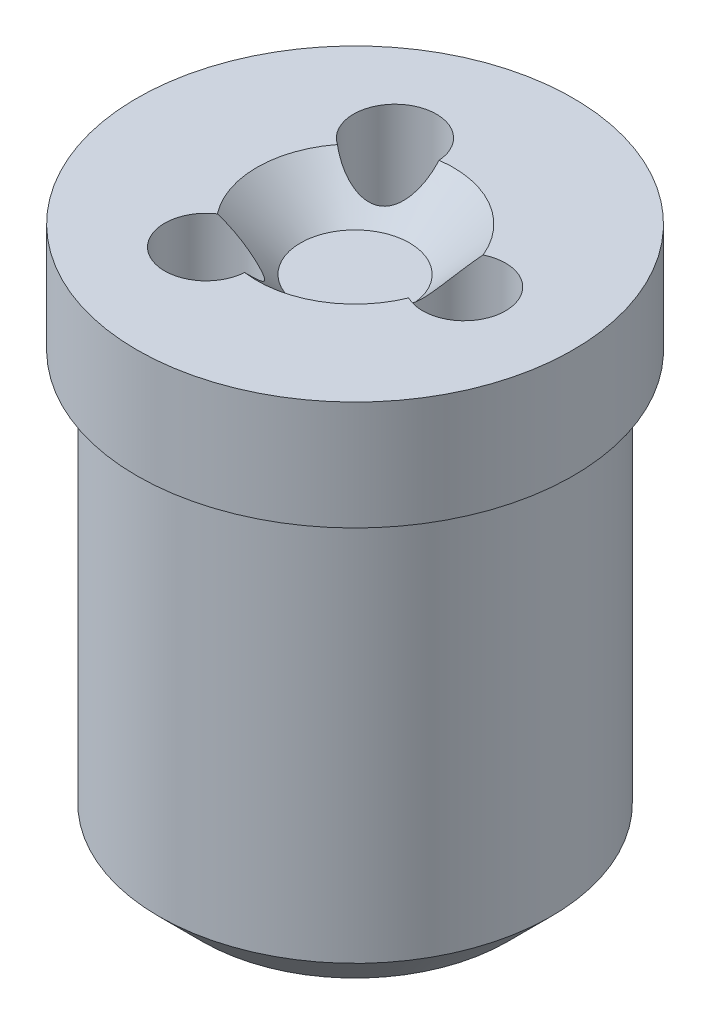
ISO-10303-21;
HEADER;
FILE_DESCRIPTION(('STEP AP214'),'2;1');
FILE_NAME('part.step','',(''),(''),'','','');
FILE_SCHEMA(('AUTOMOTIVE_DESIGN { 1 0 10303 214 1 1 1 1 }'));
ENDSEC;
DATA;
#1=APPLICATION_CONTEXT('core data for automotive mechanical design processes');
#2=APPLICATION_PROTOCOL_DEFINITION('international standard','automotive_design',2000,#1);
#3=PRODUCT_CONTEXT('',#1,'mechanical');
#4=PRODUCT('Part','Part','',(#3));
#5=PRODUCT_RELATED_PRODUCT_CATEGORY('part','',(#4));
#6=PRODUCT_DEFINITION_FORMATION('','',#4);
#7=PRODUCT_DEFINITION_CONTEXT('part definition',#1,'design');
#8=PRODUCT_DEFINITION('design','',#6,#7);
#9=PRODUCT_DEFINITION_SHAPE('','',#8);
#10=(LENGTH_UNIT() NAMED_UNIT(*) SI_UNIT(.MILLI.,.METRE.));
#11=(NAMED_UNIT(*) PLANE_ANGLE_UNIT() SI_UNIT($,.RADIAN.));
#12=(NAMED_UNIT(*) SI_UNIT($,.STERADIAN.) SOLID_ANGLE_UNIT());
#13=UNCERTAINTY_MEASURE_WITH_UNIT(LENGTH_MEASURE(1.E-05),#10,'distance_accuracy_value','');
#14=(GEOMETRIC_REPRESENTATION_CONTEXT(3) GLOBAL_UNCERTAINTY_ASSIGNED_CONTEXT((#13)) GLOBAL_UNIT_ASSIGNED_CONTEXT((#10,
#11,#12)) REPRESENTATION_CONTEXT('',''));
#15=CARTESIAN_POINT('',(0.,0.,0.));
#16=DIRECTION('',(0.,0.,1.));
#17=DIRECTION('',(1.,0.,0.));
#18=AXIS2_PLACEMENT_3D('',#15,#16,#17);
#19=CARTESIAN_POINT('',(-2.5,-11.,-4.33012701892219));
#20=DIRECTION('',(0.,1.,0.));
#21=DIRECTION('',(0.,0.,1.));
#22=AXIS2_PLACEMENT_3D('',#19,#20,#21);
#23=CYLINDRICAL_SURFACE('',#22,1.9);
#24=CARTESIAN_POINT('',(-2.5,0.,-4.33012701892219));
#25=DIRECTION('',(0.,1.,0.));
#26=DIRECTION('',(0.,0.,1.));
#27=AXIS2_PLACEMENT_3D('',#24,#25,#26);
#28=CIRCLE('',#27,1.9);
#29=CARTESIAN_POINT('',(-2.5,0.,-2.43012701892219));
#30=VERTEX_POINT('',#29);
#31=EDGE_CURVE('E89',#30,#30,#28,.T.);
#32=ORIENTED_EDGE('',*,*,#31,.F.);
#33=EDGE_LOOP('',(#32));
#34=FACE_BOUND('',#33,.T.);
#35=CARTESIAN_POINT('',(-0.604404751104225,25.0002000000001,-4.45942764677746));
#36=CARTESIAN_POINT('',(-0.599668557166781,24.9303759153267,-4.38957427828879));
#37=CARTESIAN_POINT('',(-0.598730209900113,24.8606328105864,-4.31934334640202));
#38=CARTESIAN_POINT('',(-0.604752949242094,24.7217550651831,-4.17824515643162));
#39=CARTESIAN_POINT('',(-0.611735709990161,24.6526226181537,-4.10737668136013));
#40=CARTESIAN_POINT('',(-0.634065851653406,24.5149881738562,-3.9646642158343));
#41=CARTESIAN_POINT('',(-0.649511840514175,24.4465034848329,-3.89281865744846));
#42=CARTESIAN_POINT('',(-0.689402532026935,24.3120902945434,-3.74937250094704));
#43=CARTESIAN_POINT('',(-0.713835124648289,24.2461584846532,-3.67777170345184));
#44=CARTESIAN_POINT('',(-0.771108008455887,24.1215479889046,-3.53874041544459));
#45=CARTESIAN_POINT('',(-0.803449280419485,24.062670583967,-3.47128541643546));
#46=CARTESIAN_POINT('',(-0.878183755784847,23.9505735107202,-3.33736371671739));
#47=CARTESIAN_POINT('',(-0.920554614180125,23.8973416410528,-3.27089516320321));
#48=CARTESIAN_POINT('',(-1.00808025592113,23.8086058119301,-3.15174014058094));
#49=CARTESIAN_POINT('',(-1.05131422864947,23.7716396058287,-3.0987531381169));
#50=CARTESIAN_POINT('',(-1.14628022286434,23.7063390077541,-2.99507863368145));
#51=CARTESIAN_POINT('',(-1.19799459130712,23.6779870266942,-2.94438662832827));
#52=CARTESIAN_POINT('',(-1.29654676217973,23.6385868521668,-2.8587726616446));
#53=CARTESIAN_POINT('',(-1.34160213331784,23.6250236935653,-2.82297466261922));
#54=CARTESIAN_POINT('',(-1.4359483091511,23.6061957555486,-2.75495590309173));
#55=CARTESIAN_POINT('',(-1.48523482303968,23.6009226715887,-2.72273159278756));
#56=CARTESIAN_POINT('',(-1.58682841535246,23.5992992592671,-2.66291409368128));
#57=CARTESIAN_POINT('',(-1.63914166703556,23.6029678427725,-2.63533085272249));
#58=CARTESIAN_POINT('',(-1.74503504432828,23.6188093273341,-2.58557511922954));
#59=CARTESIAN_POINT('',(-1.79861622022461,23.6309895355343,-2.56340729786311));
#60=CARTESIAN_POINT('',(-1.92040610745496,23.6669539738895,-2.51922961085677));
#61=CARTESIAN_POINT('',(-1.98856199076442,23.6930158167412,-2.49895897777599));
#62=CARTESIAN_POINT('',(-2.12291130313104,23.7537916159803,-2.46663399252473));
#63=CARTESIAN_POINT('',(-2.18910016358683,23.7885241836469,-2.45459752518222));
#64=CARTESIAN_POINT('',(-2.35671778677612,23.8859893916301,-2.43270144820569));
#65=CARTESIAN_POINT('',(-2.45618411238218,23.9532377459125,-2.42820604233024));
#66=CARTESIAN_POINT('',(-2.64870118932149,24.0963011275469,-2.43349572689294));
#67=CARTESIAN_POINT('',(-2.74171670447375,24.1721580211519,-2.44335362909352));
#68=CARTESIAN_POINT('',(-2.90000665951015,24.3100765658009,-2.47141371366074));
#69=CARTESIAN_POINT('',(-2.96662847608191,24.3711432659243,-2.48708246915917));
#70=CARTESIAN_POINT('',(-3.09629345186112,24.4951495447694,-2.52485730322536));
#71=CARTESIAN_POINT('',(-3.15933378504841,24.558090544352,-2.54696838315807));
#72=CARTESIAN_POINT('',(-3.28071058970273,24.6839749831661,-2.59671438997999));
#73=CARTESIAN_POINT('',(-3.33911026436135,24.7468989340282,-2.6242453935206));
#74=CARTESIAN_POINT('',(-3.4522098436499,24.8732567455034,-2.68471451405383));
#75=CARTESIAN_POINT('',(-3.50691586334787,24.9366895586115,-2.71764336844748));
#76=CARTESIAN_POINT('',(-3.55977525289579,25.0002,-2.75314369201297));
#77=B_SPLINE_CURVE_WITH_KNOTS('',3,(#35,#36,#37,#38,#39,#40,#41,#42,#43,#44,#45,#46,#47,#48,#49,
#50,#51,#52,#53,#54,#55,#56,#57,#58,#59,#60,#61,#62,#63,#64,#65,#66,#67,#68,#69,#70,#71,#72,#73,
#74,#75,#76),.UNSPECIFIED.,.F.,.F.,(4,2,2,2,2,2,2,2,2,2,2,2,2,2,2,2,2,2,2,2,4),(0.,
0.296608560011013,0.594030677231719,0.894994214319666,1.19555366061906,1.48060069933349,
1.7650185591453,1.99750632028336,2.22951613214999,2.40614634553788,2.58259950740994,
2.75942619618997,2.93640487569256,3.16232924754416,3.38874278828777,3.74721173724148,
4.10750548252977,4.38235082863932,4.65741011635818,4.92763471089975,5.19740036863589),.UNSPECIFIED.);
#78=CARTESIAN_POINT('',(-0.604391120763007,25.,-4.45922766554286));
#79=VERTEX_POINT('',#78);
#80=CARTESIAN_POINT('',(-3.5596088792363,24.9999999999992,-2.75303189717348));
#81=VERTEX_POINT('',#80);
#82=EDGE_CURVE('E61',#79,#81,#77,.T.);
#83=ORIENTED_EDGE('',*,*,#82,.F.);
#84=CARTESIAN_POINT('',(-2.5,25.,-4.33012701892219));
#85=DIRECTION('',(0.,1.,0.));
#86=DIRECTION('',(0.,0.,1.));
#87=AXIS2_PLACEMENT_3D('',#84,#85,#86);
#88=CIRCLE('',#87,1.9);
#89=EDGE_CURVE('E84',#79,#81,#88,.T.);
#90=ORIENTED_EDGE('',*,*,#89,.T.);
#91=EDGE_LOOP('',(#83,#90));
#92=FACE_BOUND('',#91,.T.);
#93=ADVANCED_FACE('F35',(#34,#92),#23,.F.);
#94=CARTESIAN_POINT('',(-2.5,-11.,4.33012701892219));
#95=DIRECTION('',(0.,1.,0.));
#96=DIRECTION('',(0.,0.,1.));
#97=AXIS2_PLACEMENT_3D('',#94,#95,#96);
#98=CYLINDRICAL_SURFACE('',#97,1.9);
#99=CARTESIAN_POINT('',(-2.5,0.,4.33012701892219));
#100=DIRECTION('',(0.,1.,0.));
#101=DIRECTION('',(0.,0.,1.));
#102=AXIS2_PLACEMENT_3D('',#99,#100,#101);
#103=CIRCLE('',#102,1.9);
#104=CARTESIAN_POINT('',(-2.5,0.,6.23012701892219));
#105=VERTEX_POINT('',#104);
#106=EDGE_CURVE('E93',#105,#105,#103,.T.);
#107=ORIENTED_EDGE('',*,*,#106,.F.);
#108=EDGE_LOOP('',(#107));
#109=FACE_BOUND('',#108,.T.);
#110=CARTESIAN_POINT('',(-3.55977525289578,25.0002,2.75314369201296));
#111=CARTESIAN_POINT('',(-3.50164855821339,24.9303759153266,2.71411534350155));
#112=CARTESIAN_POINT('',(-3.44129596070132,24.8606328105863,2.67818724498766));
#113=CARTESIAN_POINT('',(-3.31608997408797,24.721755065183,2.612853995273));
#114=CARTESIAN_POINT('',(-3.25122469397456,24.6526226181536,2.58346700593363));
#115=CARTESIAN_POINT('',(-3.11646700256086,24.5149881738562,2.5314492431212));
#116=CARTESIAN_POINT('',(-3.04652392941925,24.4465034848328,2.50890308266827));
#117=CARTESIAN_POINT('',(-2.90235056805741,24.3120902945433,2.47172635664215));
#118=CARTESIAN_POINT('',(-2.82812616218467,24.2461584846532,2.45708520378496));
#119=CARTESIAN_POINT('',(-2.67908509294572,24.1215479889046,2.43716933210671));
#120=CARTESIAN_POINT('',(-2.60449671420976,24.0626705839669,2.43145019571333));
#121=CARTESIAN_POINT('',(-2.45114988245325,23.9505735107202,2.4292113000592));
#122=CARTESIAN_POINT('',(-2.37240099735953,23.8973416410527,2.43267126305258));
#123=CARTESIAN_POINT('',(-2.22544689990963,23.8086058119301,2.44889318097169));
#124=CARTESIAN_POINT('',(-2.15794182334122,23.7716396058287,2.45984139842893));
#125=CARTESIAN_POINT('',(-2.02067407166792,23.7063390077541,2.49024710969693));
#126=CARTESIAN_POINT('',(-1.9509163230419,23.6779870266942,2.50968706383246));
#127=CARTESIAN_POINT('',(-1.82749636753879,23.6385868521668,2.55222876406442));
#128=CARTESIAN_POINT('',(-1.7739667054091,23.6250236935653,2.57334886053426));
#129=CARTESIAN_POINT('',(-1.66788764380776,23.6061957555486,2.62104566579204));
#130=CARTESIAN_POINT('',(-1.61533731552063,23.6009226715887,2.64761688373144));
#131=CARTESIAN_POINT('',(-1.51273704554735,23.599299259267,2.70569076598289));
#132=CARTESIAN_POINT('',(-1.46269263231678,23.6029678427725,2.73720375041562));
#133=CARTESIAN_POINT('',(-1.36665621448161,23.6188093273341,2.80403223849718));
#134=CARTESIAN_POINT('',(-1.32066773008356,23.6309895355343,2.83935098730483));
#135=CARTESIAN_POINT('',(-1.22151378724045,23.6669539738895,2.92273528006718));
#136=CARTESIAN_POINT('',(-1.16988096238698,23.6930158167412,2.97162468989015));
#137=CARTESIAN_POINT('',(-1.07471204779911,23.7537916159803,3.07181211475499));
#138=CARTESIAN_POINT('',(-1.03119373108079,23.7885241836469,3.123115115686));
#139=CARTESIAN_POINT('',(-0.928422360581241,23.8859893916301,3.25732819700163));
#140=CARTESIAN_POINT('',(-0.874796062089747,23.9532377459126,3.34122085885985));
#141=CARTESIAN_POINT('',(-0.783118524829401,24.096301127547,3.51059038043297));
#142=CARTESIAN_POINT('',(-0.745147960987002,24.172158021152,3.59607313060122));
#143=CARTESIAN_POINT('',(-0.690303729536349,24.310076565801,3.74718629511026));
#144=CARTESIAN_POINT('',(-0.670562361557801,24.3711432659243,3.81271685845688));
#145=CARTESIAN_POINT('',(-0.638443839593258,24.4951495447694,3.94389743849587));
#146=CARTESIAN_POINT('',(-0.626072429926453,24.5580905443521,4.00954750846546));
#147=CARTESIAN_POINT('',(-0.608465333243915,24.6839749831662,4.13953590813725));
#148=CARTESIAN_POINT('',(-0.60310804437245,24.7468989340283,4.20387701173466));
#149=CARTESIAN_POINT('',(-0.59892604925446,24.8732567455034,4.3320586808225));
#150=CARTESIAN_POINT('',(-0.600090263827899,24.9366895586115,4.3958999108177));
#151=CARTESIAN_POINT('',(-0.604404751104224,25.0002,4.45942764677748));
#152=B_SPLINE_CURVE_WITH_KNOTS('',3,(#110,#111,#112,#113,#114,#115,#116,#117,#118,#119,#120,
#121,#122,#123,#124,#125,#126,#127,#128,#129,#130,#131,#132,#133,#134,#135,#136,#137,#138,#139,
#140,#141,#142,#143,#144,#145,#146,#147,#148,#149,#150,#151),.UNSPECIFIED.,.F.,.F.,(4,2,2,2,2,2,
2,2,2,2,2,2,2,2,2,2,2,2,2,2,4),(0.,0.296608560011004,0.594030677231706,0.89499421431965,
1.19555366061903,1.48060069933346,1.76501855914525,1.9975063202833,2.22951613214993,
2.40614634553781,2.58259950740988,2.7594261961899,2.93640487569249,3.16232924754409,
3.38874278828771,3.74721173724144,4.10750548252974,4.3823508286393,4.65741011635817,
4.92763471089975,5.1974003686359),.UNSPECIFIED.);
#153=CARTESIAN_POINT('',(-3.55960887923699,25.,2.75303189717394));
#154=VERTEX_POINT('',#153);
#155=CARTESIAN_POINT('',(-0.604391120763007,25.,4.45922766554286));
#156=VERTEX_POINT('',#155);
#157=EDGE_CURVE('E85',#154,#156,#152,.T.);
#158=ORIENTED_EDGE('',*,*,#157,.F.);
#159=CARTESIAN_POINT('',(-2.5,25.,4.33012701892219));
#160=DIRECTION('',(0.,1.,0.));
#161=DIRECTION('',(0.,0.,1.));
#162=AXIS2_PLACEMENT_3D('',#159,#160,#161);
#163=CIRCLE('',#162,1.9);
#164=EDGE_CURVE('E90',#154,#156,#163,.T.);
#165=ORIENTED_EDGE('',*,*,#164,.T.);
#166=EDGE_LOOP('',(#158,#165));
#167=FACE_BOUND('',#166,.T.);
#168=ADVANCED_FACE('F157',(#109,#167),#98,.F.);
#169=CARTESIAN_POINT('',(5.,-11.,0.));
#170=DIRECTION('',(0.,1.,0.));
#171=DIRECTION('',(0.,0.,1.));
#172=AXIS2_PLACEMENT_3D('',#169,#170,#171);
#173=CYLINDRICAL_SURFACE('',#172,1.9);
#174=CARTESIAN_POINT('',(5.,0.,0.));
#175=DIRECTION('',(0.,1.,0.));
#176=DIRECTION('',(0.,0.,1.));
#177=AXIS2_PLACEMENT_3D('',#174,#175,#176);
#178=CIRCLE('',#177,1.9);
#179=CARTESIAN_POINT('',(5.,0.,1.9));
#180=VERTEX_POINT('',#179);
#181=EDGE_CURVE('E107',#180,#180,#178,.T.);
#182=ORIENTED_EDGE('',*,*,#181,.F.);
#183=EDGE_LOOP('',(#182));
#184=FACE_BOUND('',#183,.T.);
#185=CARTESIAN_POINT('',(4.16418000400001,25.0002,1.70628395476444));
#186=CARTESIAN_POINT('',(4.10131711538018,24.9303759153266,1.67545893478718));
#187=CARTESIAN_POINT('',(4.04002617060145,24.8606328105864,1.6411561014143));
#188=CARTESIAN_POINT('',(3.92084292333008,24.721755065183,1.56539116115857));
#189=CARTESIAN_POINT('',(3.86296040396474,24.6526226181536,1.52390967542645));
#190=CARTESIAN_POINT('',(3.75053285421428,24.5149881738562,1.43321497271305));
#191=CARTESIAN_POINT('',(3.69603576993345,24.4465034848328,1.38391557478013));
#192=CARTESIAN_POINT('',(3.59175310008437,24.3120902945433,1.27764614430485));
#193=CARTESIAN_POINT('',(3.54196128683298,24.2461584846532,1.22068649966684));
#194=CARTESIAN_POINT('',(3.45019310140163,24.1215479889046,1.10157108333783));
#195=CARTESIAN_POINT('',(3.40794599462927,24.0626705839669,1.03983522072209));
#196=CARTESIAN_POINT('',(3.32933363823812,23.9505735107202,0.908152416658154));
#197=CARTESIAN_POINT('',(3.29295561153968,23.8973416410528,0.838223900150601));
#198=CARTESIAN_POINT('',(3.23352715583078,23.8086058119301,0.702846959609219));
#199=CARTESIAN_POINT('',(3.20925605199071,23.7716396058287,0.63891173968794));
#200=CARTESIAN_POINT('',(3.16695429453228,23.7063390077541,0.504831523984494));
#201=CARTESIAN_POINT('',(3.14891091434905,23.6779870266942,0.434699564495783));
#202=CARTESIAN_POINT('',(3.12404312971855,23.6385868521668,0.306543897580167));
#203=CARTESIAN_POINT('',(3.11556883872697,23.6250236935653,0.249625802084939));
#204=CARTESIAN_POINT('',(3.10383595295889,23.6061957555486,0.133910237299676));
#205=CARTESIAN_POINT('',(3.10057213856034,23.6009226715887,0.0751147090561062));
#206=CARTESIAN_POINT('',(3.09956546089983,23.5992992592671,-0.0427766723016233));
#207=CARTESIAN_POINT('',(3.10183429935236,23.6029678427725,-0.101872897693145));
#208=CARTESIAN_POINT('',(3.11169125880991,23.6188093273341,-0.218457119267643));
#209=CARTESIAN_POINT('',(3.11928395030819,23.6309895355343,-0.275943689441724));
#210=CARTESIAN_POINT('',(3.14191989469543,23.6669539738895,-0.403505669210421));
#211=CARTESIAN_POINT('',(3.15844295315142,23.6930158167412,-0.472665712114171));
#212=CARTESIAN_POINT('',(3.19762335093018,23.7537916159803,-0.605178122230269));
#213=CARTESIAN_POINT('',(3.22029389466765,23.7885241836469,-0.668517590503778));
#214=CARTESIAN_POINT('',(3.2851401473574,23.8859893916301,-0.824626748795945));
#215=CARTESIAN_POINT('',(3.33098017447197,23.9532377459126,-0.913014816529613));
#216=CARTESIAN_POINT('',(3.43181971415093,24.096301127547,-1.07709465354003));
#217=CARTESIAN_POINT('',(3.48686466546079,24.172158021152,-1.15271950150769));
#218=CARTESIAN_POINT('',(3.59031038904655,24.310076565801,-1.2757725814495));
#219=CARTESIAN_POINT('',(3.63719083763975,24.3711432659243,-1.32563438929769));
#220=CARTESIAN_POINT('',(3.73473729145442,24.4951495447694,-1.41904013527048));
#221=CARTESIAN_POINT('',(3.7854062149749,24.5580905443521,-1.46257912530735));
#222=CARTESIAN_POINT('',(3.88917592294667,24.6839749831661,-1.54282151815721));
#223=CARTESIAN_POINT('',(3.94221830873383,24.7468989340283,-1.57963161821402));
#224=CARTESIAN_POINT('',(4.05113589290438,24.8732567455034,-1.64734416676861));
#225=CARTESIAN_POINT('',(4.10700612717578,24.9366895586115,-1.67825654237016));
#226=CARTESIAN_POINT('',(4.16418000400002,25.0002,-1.70628395476445));
#227=B_SPLINE_CURVE_WITH_KNOTS('',3,(#185,#186,#187,#188,#189,#190,#191,#192,#193,#194,#195,
#196,#197,#198,#199,#200,#201,#202,#203,#204,#205,#206,#207,#208,#209,#210,#211,#212,#213,#214,
#215,#216,#217,#218,#219,#220,#221,#222,#223,#224,#225,#226),.UNSPECIFIED.,.F.,.F.,(4,2,2,2,2,2,
2,2,2,2,2,2,2,2,2,2,2,2,2,2,4),(0.,0.296608560011004,0.594030677231707,0.894994214319653,
1.19555366061904,1.48060069933347,1.76501855914526,1.99750632028331,2.22951613214994,
2.40614634553783,2.58259950740989,2.75942619618991,2.93640487569251,3.16232924754411,
3.38874278828772,3.74721173724145,4.10750548252975,4.38235082863929,4.65741011635814,
4.9276347108997,5.19740036863583),.UNSPECIFIED.);
#228=CARTESIAN_POINT('',(4.164,25.,1.70619576836892));
#229=VERTEX_POINT('',#228);
#230=CARTESIAN_POINT('',(4.16399999999925,24.9999999999992,-1.70619576836855));
#231=VERTEX_POINT('',#230);
#232=EDGE_CURVE('E11',#229,#231,#227,.T.);
#233=ORIENTED_EDGE('',*,*,#232,.F.);
#234=CARTESIAN_POINT('',(5.,25.,0.));
#235=DIRECTION('',(0.,1.,0.));
#236=DIRECTION('',(0.,0.,1.));
#237=AXIS2_PLACEMENT_3D('',#234,#235,#236);
#238=CIRCLE('',#237,1.9);
#239=EDGE_CURVE('E82',#229,#231,#238,.T.);
#240=ORIENTED_EDGE('',*,*,#239,.T.);
#241=EDGE_LOOP('',(#233,#240));
#242=FACE_BOUND('',#241,.T.);
#243=ADVANCED_FACE('F88',(#184,#242),#173,.F.);
#244=CARTESIAN_POINT('',(0.,20.,0.));
#245=DIRECTION('',(0.,-1.,0.));
#246=DIRECTION('',(0.,0.,-1.));
#247=AXIS2_PLACEMENT_3D('',#244,#245,#246);
#248=CYLINDRICAL_SURFACE('',#247,8.99);
#249=CARTESIAN_POINT('',(0.,2.,0.));
#250=DIRECTION('',(0.,1.,0.));
#251=DIRECTION('',(0.,0.,1.));
#252=AXIS2_PLACEMENT_3D('',#249,#250,#251);
#253=CIRCLE('',#252,8.99);
#254=CARTESIAN_POINT('',(0.,2.,8.99));
#255=VERTEX_POINT('',#254);
#256=EDGE_CURVE('E119',#255,#255,#253,.T.);
#257=ORIENTED_EDGE('',*,*,#256,.T.);
#258=EDGE_LOOP('',(#257));
#259=FACE_BOUND('',#258,.T.);
#260=CARTESIAN_POINT('',(0.,20.,0.));
#261=DIRECTION('',(0.,1.,0.));
#262=DIRECTION('',(0.,0.,1.));
#263=AXIS2_PLACEMENT_3D('',#260,#261,#262);
#264=CIRCLE('',#263,8.99);
#265=CARTESIAN_POINT('',(0.,20.,8.99));
#266=VERTEX_POINT('',#265);
#267=EDGE_CURVE('E114',#266,#266,#264,.T.);
#268=ORIENTED_EDGE('',*,*,#267,.F.);
#269=EDGE_LOOP('',(#268));
#270=FACE_BOUND('',#269,.T.);
#271=ADVANCED_FACE('F132',(#259,#270),#248,.T.);
#272=CARTESIAN_POINT('',(0.,0.,0.));
#273=DIRECTION('',(0.,1.,0.));
#274=DIRECTION('',(0.,0.,1.));
#275=AXIS2_PLACEMENT_3D('',#272,#273,#274);
#276=PLANE('',#275);
#277=ORIENTED_EDGE('',*,*,#181,.T.);
#278=EDGE_LOOP('',(#277));
#279=FACE_BOUND('',#278,.T.);
#280=ORIENTED_EDGE('',*,*,#106,.T.);
#281=EDGE_LOOP('',(#280));
#282=FACE_BOUND('',#281,.T.);
#283=ORIENTED_EDGE('',*,*,#31,.T.);
#284=EDGE_LOOP('',(#283));
#285=FACE_BOUND('',#284,.T.);
#286=CARTESIAN_POINT('',(0.,0.,0.));
#287=DIRECTION('',(0.,1.,0.));
#288=DIRECTION('',(0.,0.,1.));
#289=AXIS2_PLACEMENT_3D('',#286,#287,#288);
#290=CIRCLE('',#289,6.99);
#291=CARTESIAN_POINT('',(0.,0.,6.99));
#292=VERTEX_POINT('',#291);
#293=EDGE_CURVE('E48',#292,#292,#290,.F.);
#294=ORIENTED_EDGE('',*,*,#293,.T.);
#295=EDGE_LOOP('',(#294));
#296=FACE_BOUND('',#295,.T.);
#297=ADVANCED_FACE('F124',(#279,#282,#285,#296),#276,.F.);
#298=CARTESIAN_POINT('',(0.,25.,0.));
#299=DIRECTION('',(0.,-1.,0.));
#300=DIRECTION('',(0.,0.,-1.));
#301=AXIS2_PLACEMENT_3D('',#298,#299,#300);
#302=CYLINDRICAL_SURFACE('',#301,10.);
#303=CARTESIAN_POINT('',(0.,25.,0.));
#304=DIRECTION('',(0.,1.,0.));
#305=DIRECTION('',(0.,0.,1.));
#306=AXIS2_PLACEMENT_3D('',#303,#304,#305);
#307=CIRCLE('',#306,10.);
#308=CARTESIAN_POINT('',(0.,25.,10.));
#309=VERTEX_POINT('',#308);
#310=EDGE_CURVE('E111',#309,#309,#307,.T.);
#311=ORIENTED_EDGE('',*,*,#310,.F.);
#312=EDGE_LOOP('',(#311));
#313=FACE_BOUND('',#312,.T.);
#314=CARTESIAN_POINT('',(0.,20.,0.));
#315=DIRECTION('',(0.,1.,0.));
#316=DIRECTION('',(0.,0.,1.));
#317=AXIS2_PLACEMENT_3D('',#314,#315,#316);
#318=CIRCLE('',#317,10.);
#319=CARTESIAN_POINT('',(0.,20.,10.));
#320=VERTEX_POINT('',#319);
#321=EDGE_CURVE('E110',#320,#320,#318,.T.);
#322=ORIENTED_EDGE('',*,*,#321,.T.);
#323=EDGE_LOOP('',(#322));
#324=FACE_BOUND('',#323,.T.);
#325=ADVANCED_FACE('F142',(#313,#324),#302,.T.);
#326=CARTESIAN_POINT('',(0.,25.,0.));
#327=DIRECTION('',(0.,1.,0.));
#328=DIRECTION('',(0.,0.,1.));
#329=AXIS2_PLACEMENT_3D('',#326,#327,#328);
#330=PLANE('',#329);
#331=ORIENTED_EDGE('',*,*,#164,.F.);
#332=CARTESIAN_POINT('',(0.,25.,0.));
#333=DIRECTION('',(0.,1.,0.));
#334=DIRECTION('',(0.,0.,1.));
#335=AXIS2_PLACEMENT_3D('',#332,#333,#334);
#336=CIRCLE('',#335,4.5);
#337=EDGE_CURVE('E87',#154,#81,#336,.F.);
#338=ORIENTED_EDGE('',*,*,#337,.T.);
#339=ORIENTED_EDGE('',*,*,#89,.F.);
#340=EDGE_CURVE('E73',#79,#231,#336,.F.);
#341=ORIENTED_EDGE('',*,*,#340,.T.);
#342=ORIENTED_EDGE('',*,*,#239,.F.);
#343=EDGE_CURVE('E54',#229,#156,#336,.F.);
#344=ORIENTED_EDGE('',*,*,#343,.T.);
#345=EDGE_LOOP('',(#331,#338,#339,#341,#342,#344));
#346=FACE_BOUND('',#345,.T.);
#347=ORIENTED_EDGE('',*,*,#310,.T.);
#348=EDGE_LOOP('',(#347));
#349=FACE_BOUND('',#348,.T.);
#350=ADVANCED_FACE('F80',(#346,#349),#330,.T.);
#351=CARTESIAN_POINT('',(0.,20.,0.));
#352=DIRECTION('',(0.,1.,0.));
#353=DIRECTION('',(0.,0.,1.));
#354=AXIS2_PLACEMENT_3D('',#351,#352,#353);
#355=PLANE('',#354);
#356=ORIENTED_EDGE('',*,*,#267,.T.);
#357=EDGE_LOOP('',(#356));
#358=FACE_BOUND('',#357,.T.);
#359=ORIENTED_EDGE('',*,*,#321,.F.);
#360=EDGE_LOOP('',(#359));
#361=FACE_BOUND('',#360,.T.);
#362=ADVANCED_FACE('F129',(#358,#361),#355,.F.);
#363=CARTESIAN_POINT('',(0.,2.,0.));
#364=DIRECTION('',(0.,1.,0.));
#365=DIRECTION('',(0.,0.,1.));
#366=AXIS2_PLACEMENT_3D('',#363,#364,#365);
#367=CONICAL_SURFACE('',#366,8.99,0.78539816339745);
#368=ORIENTED_EDGE('',*,*,#293,.F.);
#369=EDGE_LOOP('',(#368));
#370=FACE_BOUND('',#369,.T.);
#371=ORIENTED_EDGE('',*,*,#256,.F.);
#372=EDGE_LOOP('',(#371));
#373=FACE_BOUND('',#372,.T.);
#374=ADVANCED_FACE('F37',(#370,#373),#367,.T.);
#375=CARTESIAN_POINT('',(0.,23.,0.));
#376=DIRECTION('',(0.,1.,0.));
#377=DIRECTION('',(0.,0.,1.));
#378=AXIS2_PLACEMENT_3D('',#375,#376,#377);
#379=PLANE('',#378);
#380=CARTESIAN_POINT('',(0.,23.,0.));
#381=DIRECTION('',(0.,-1.,0.));
#382=DIRECTION('',(0.,0.,-1.));
#383=AXIS2_PLACEMENT_3D('',#380,#381,#382);
#384=CIRCLE('',#383,2.5);
#385=CARTESIAN_POINT('',(0.,23.,-2.5));
#386=VERTEX_POINT('',#385);
#387=EDGE_CURVE('E185',#386,#386,#384,.T.);
#388=ORIENTED_EDGE('',*,*,#387,.F.);
#389=EDGE_LOOP('',(#388));
#390=FACE_BOUND('',#389,.T.);
#391=ADVANCED_FACE('F128',(#390),#379,.T.);
#392=CARTESIAN_POINT('',(0.,26.2808379621201,0.));
#393=DIRECTION('',(0.,1.,0.));
#394=DIRECTION('',(0.,0.,1.));
#395=AXIS2_PLACEMENT_3D('',#392,#393,#394);
#396=CONICAL_SURFACE('',#395,5.78083796212011,0.785398163397447);
#397=ORIENTED_EDGE('',*,*,#157,.T.);
#398=ORIENTED_EDGE('',*,*,#343,.F.);
#399=ORIENTED_EDGE('',*,*,#232,.T.);
#400=ORIENTED_EDGE('',*,*,#340,.F.);
#401=ORIENTED_EDGE('',*,*,#82,.T.);
#402=ORIENTED_EDGE('',*,*,#337,.F.);
#403=EDGE_LOOP('',(#397,#398,#399,#400,#401,#402));
#404=FACE_BOUND('',#403,.T.);
#405=ORIENTED_EDGE('',*,*,#387,.T.);
#406=EDGE_LOOP('',(#405));
#407=FACE_BOUND('',#406,.T.);
#408=ADVANCED_FACE('F71',(#404,#407),#396,.F.);
#409=CLOSED_SHELL('',(#93,#168,#243,#271,#297,#325,#350,#362,#374,#391,#408));
#410=MANIFOLD_SOLID_BREP('B2',#409);
#411=ADVANCED_BREP_SHAPE_REPRESENTATION('',(#18,#410),#14);
#412=SHAPE_DEFINITION_REPRESENTATION(#9,#411);
ENDSEC;
END-ISO-10303-21;
